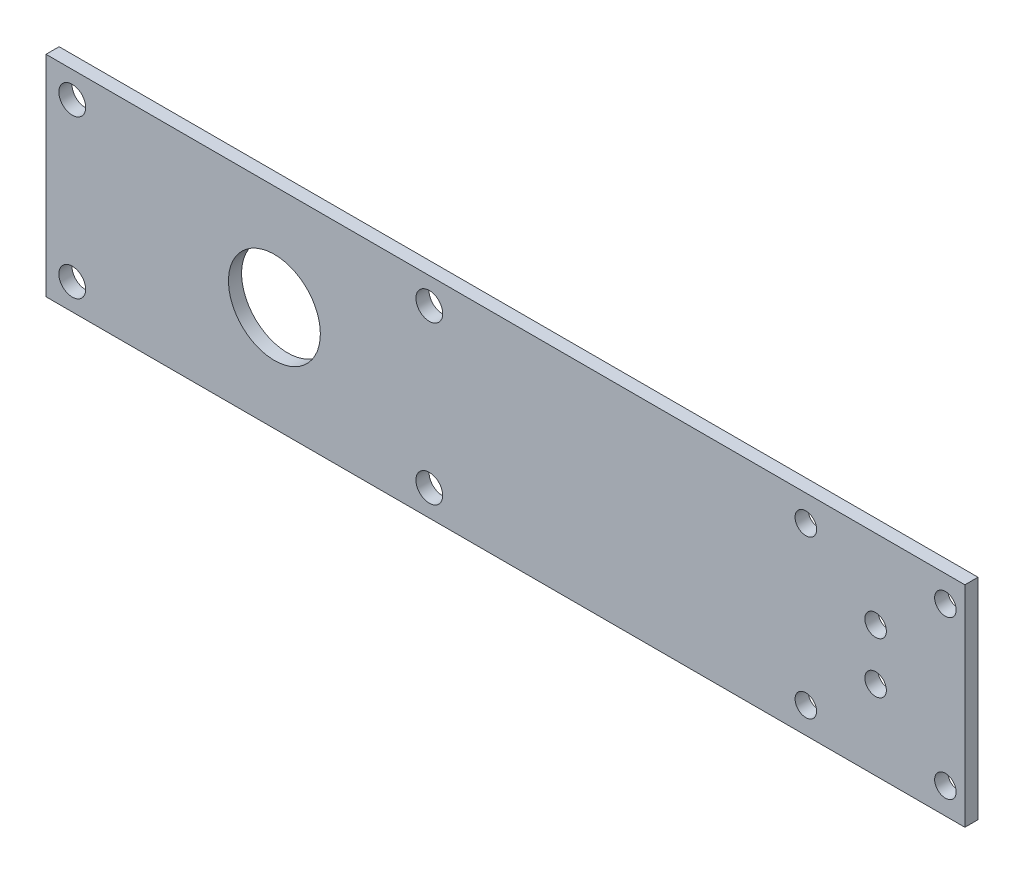
ISO-10303-21;
HEADER;
FILE_DESCRIPTION(('STEP AP214'),'2;1');
FILE_NAME('part.step','',(''),(''),'','','');
FILE_SCHEMA(('AUTOMOTIVE_DESIGN { 1 0 10303 214 1 1 1 1 }'));
ENDSEC;
DATA;
#1=APPLICATION_CONTEXT('core data for automotive mechanical design processes');
#2=APPLICATION_PROTOCOL_DEFINITION('international standard','automotive_design',2000,#1);
#3=PRODUCT_CONTEXT('',#1,'mechanical');
#4=PRODUCT('Part','Part','',(#3));
#5=PRODUCT_RELATED_PRODUCT_CATEGORY('part','',(#4));
#6=PRODUCT_DEFINITION_FORMATION('','',#4);
#7=PRODUCT_DEFINITION_CONTEXT('part definition',#1,'design');
#8=PRODUCT_DEFINITION('design','',#6,#7);
#9=PRODUCT_DEFINITION_SHAPE('','',#8);
#10=(LENGTH_UNIT() NAMED_UNIT(*) SI_UNIT(.MILLI.,.METRE.));
#11=(NAMED_UNIT(*) PLANE_ANGLE_UNIT() SI_UNIT($,.RADIAN.));
#12=(NAMED_UNIT(*) SI_UNIT($,.STERADIAN.) SOLID_ANGLE_UNIT());
#13=UNCERTAINTY_MEASURE_WITH_UNIT(LENGTH_MEASURE(1.E-05),#10,'distance_accuracy_value','');
#14=(GEOMETRIC_REPRESENTATION_CONTEXT(3) GLOBAL_UNCERTAINTY_ASSIGNED_CONTEXT((#13)) GLOBAL_UNIT_ASSIGNED_CONTEXT((#10,
#11,#12)) REPRESENTATION_CONTEXT('',''));
#15=CARTESIAN_POINT('',(0.,0.,0.));
#16=DIRECTION('',(0.,0.,1.));
#17=DIRECTION('',(1.,0.,0.));
#18=AXIS2_PLACEMENT_3D('',#15,#16,#17);
#19=CARTESIAN_POINT('',(-87.,-40.,5.));
#20=DIRECTION('',(1.,0.,0.));
#21=DIRECTION('',(0.,1.,0.));
#22=AXIS2_PLACEMENT_3D('',#19,#20,#21);
#23=PLANE('',#22);
#24=DIRECTION('',(0.,-1.,0.));
#25=VECTOR('',#24,1.);
#26=CARTESIAN_POINT('',(-87.,-40.,0.));
#27=LINE('',#26,#25);
#28=CARTESIAN_POINT('',(-87.,40.,0.));
#29=VERTEX_POINT('',#28);
#30=CARTESIAN_POINT('',(-87.,-40.,0.));
#31=VERTEX_POINT('',#30);
#32=EDGE_CURVE('E113',#29,#31,#27,.T.);
#33=ORIENTED_EDGE('',*,*,#32,.T.);
#34=DIRECTION('',(0.,0.,-1.));
#35=VECTOR('',#34,1.);
#36=CARTESIAN_POINT('',(-87.,-40.,5.));
#37=LINE('',#36,#35);
#38=CARTESIAN_POINT('',(-87.,-40.,5.));
#39=VERTEX_POINT('',#38);
#40=EDGE_CURVE('E12',#39,#31,#37,.T.);
#41=ORIENTED_EDGE('',*,*,#40,.F.);
#42=DIRECTION('',(0.,-1.,0.));
#43=VECTOR('',#42,1.);
#44=CARTESIAN_POINT('',(-87.,-40.,5.));
#45=LINE('',#44,#43);
#46=CARTESIAN_POINT('',(-87.,40.,5.));
#47=VERTEX_POINT('',#46);
#48=EDGE_CURVE('E100',#47,#39,#45,.T.);
#49=ORIENTED_EDGE('',*,*,#48,.F.);
#50=DIRECTION('',(0.,0.,-1.));
#51=VECTOR('',#50,1.);
#52=CARTESIAN_POINT('',(-87.,40.,5.));
#53=LINE('',#52,#51);
#54=EDGE_CURVE('E109',#47,#29,#53,.T.);
#55=ORIENTED_EDGE('',*,*,#54,.T.);
#56=EDGE_LOOP('',(#33,#41,#49,#55));
#57=FACE_BOUND('',#56,.T.);
#58=ADVANCED_FACE('F48',(#57),#23,.F.);
#59=CARTESIAN_POINT('',(263.,-40.,5.));
#60=DIRECTION('',(0.,1.,0.));
#61=DIRECTION('',(-1.,0.,0.));
#62=AXIS2_PLACEMENT_3D('',#59,#60,#61);
#63=PLANE('',#62);
#64=DIRECTION('',(1.,0.,0.));
#65=VECTOR('',#64,1.);
#66=CARTESIAN_POINT('',(263.,-40.,0.));
#67=LINE('',#66,#65);
#68=CARTESIAN_POINT('',(263.,-40.,0.));
#69=VERTEX_POINT('',#68);
#70=EDGE_CURVE('E104',#31,#69,#67,.T.);
#71=ORIENTED_EDGE('',*,*,#70,.T.);
#72=DIRECTION('',(0.,0.,-1.));
#73=VECTOR('',#72,1.);
#74=CARTESIAN_POINT('',(263.,-40.,5.));
#75=LINE('',#74,#73);
#76=CARTESIAN_POINT('',(263.,-40.,5.));
#77=VERTEX_POINT('',#76);
#78=EDGE_CURVE('E57',#77,#69,#75,.T.);
#79=ORIENTED_EDGE('',*,*,#78,.F.);
#80=DIRECTION('',(1.,0.,0.));
#81=VECTOR('',#80,1.);
#82=CARTESIAN_POINT('',(263.,-40.,5.));
#83=LINE('',#82,#81);
#84=EDGE_CURVE('E95',#39,#77,#83,.T.);
#85=ORIENTED_EDGE('',*,*,#84,.F.);
#86=ORIENTED_EDGE('',*,*,#40,.T.);
#87=EDGE_LOOP('',(#71,#79,#85,#86));
#88=FACE_BOUND('',#87,.T.);
#89=ADVANCED_FACE('F103',(#88),#63,.F.);
#90=CARTESIAN_POINT('',(263.,-40.,5.));
#91=DIRECTION('',(-1.,0.,0.));
#92=DIRECTION('',(0.,-1.,0.));
#93=AXIS2_PLACEMENT_3D('',#90,#91,#92);
#94=PLANE('',#93);
#95=DIRECTION('',(0.,1.,0.));
#96=VECTOR('',#95,1.);
#97=CARTESIAN_POINT('',(263.,-40.,0.));
#98=LINE('',#97,#96);
#99=CARTESIAN_POINT('',(263.,40.,0.));
#100=VERTEX_POINT('',#99);
#101=EDGE_CURVE('E82',#69,#100,#98,.T.);
#102=ORIENTED_EDGE('',*,*,#101,.T.);
#103=DIRECTION('',(0.,0.,-1.));
#104=VECTOR('',#103,1.);
#105=CARTESIAN_POINT('',(263.,40.,5.));
#106=LINE('',#105,#104);
#107=CARTESIAN_POINT('',(263.,40.,5.));
#108=VERTEX_POINT('',#107);
#109=EDGE_CURVE('E105',#108,#100,#106,.T.);
#110=ORIENTED_EDGE('',*,*,#109,.F.);
#111=DIRECTION('',(0.,1.,0.));
#112=VECTOR('',#111,1.);
#113=CARTESIAN_POINT('',(263.,-40.,5.));
#114=LINE('',#113,#112);
#115=EDGE_CURVE('E98',#77,#108,#114,.T.);
#116=ORIENTED_EDGE('',*,*,#115,.F.);
#117=ORIENTED_EDGE('',*,*,#78,.T.);
#118=EDGE_LOOP('',(#102,#110,#116,#117));
#119=FACE_BOUND('',#118,.T.);
#120=ADVANCED_FACE('F107',(#119),#94,.F.);
#121=CARTESIAN_POINT('',(263.,40.,5.));
#122=DIRECTION('',(0.,-1.,0.));
#123=DIRECTION('',(1.,0.,0.));
#124=AXIS2_PLACEMENT_3D('',#121,#122,#123);
#125=PLANE('',#124);
#126=DIRECTION('',(-1.,0.,0.));
#127=VECTOR('',#126,1.);
#128=CARTESIAN_POINT('',(263.,40.,0.));
#129=LINE('',#128,#127);
#130=EDGE_CURVE('E88',#100,#29,#129,.T.);
#131=ORIENTED_EDGE('',*,*,#130,.T.);
#132=ORIENTED_EDGE('',*,*,#54,.F.);
#133=DIRECTION('',(-1.,0.,0.));
#134=VECTOR('',#133,1.);
#135=CARTESIAN_POINT('',(263.,40.,5.));
#136=LINE('',#135,#134);
#137=EDGE_CURVE('E65',#108,#47,#136,.T.);
#138=ORIENTED_EDGE('',*,*,#137,.F.);
#139=ORIENTED_EDGE('',*,*,#109,.T.);
#140=EDGE_LOOP('',(#131,#132,#138,#139));
#141=FACE_BOUND('',#140,.T.);
#142=ADVANCED_FACE('F131',(#141),#125,.F.);
#143=CARTESIAN_POINT('',(0.,0.,5.));
#144=DIRECTION('',(0.,0.,1.));
#145=DIRECTION('',(1.,0.,0.));
#146=AXIS2_PLACEMENT_3D('',#143,#144,#145);
#147=PLANE('',#146);
#148=CARTESIAN_POINT('',(255.58,30.,5.));
#149=DIRECTION('',(0.,0.,1.));
#150=DIRECTION('',(-1.,0.,0.));
#151=AXIS2_PLACEMENT_3D('',#148,#149,#150);
#152=CIRCLE('',#151,4.09999999999999);
#153=CARTESIAN_POINT('',(251.48,30.,5.));
#154=VERTEX_POINT('',#153);
#155=EDGE_CURVE('E348',#154,#154,#152,.T.);
#156=ORIENTED_EDGE('',*,*,#155,.F.);
#157=EDGE_LOOP('',(#156));
#158=FACE_BOUND('',#157,.T.);
#159=CARTESIAN_POINT('',(255.58,-30.,5.));
#160=DIRECTION('',(0.,0.,1.));
#161=DIRECTION('',(1.,0.,0.));
#162=AXIS2_PLACEMENT_3D('',#159,#160,#161);
#163=CIRCLE('',#162,4.09999999999999);
#164=CARTESIAN_POINT('',(259.68,-30.,5.));
#165=VERTEX_POINT('',#164);
#166=EDGE_CURVE('E353',#165,#165,#163,.T.);
#167=ORIENTED_EDGE('',*,*,#166,.F.);
#168=EDGE_LOOP('',(#167));
#169=FACE_BOUND('',#168,.T.);
#170=CARTESIAN_POINT('',(202.42,-30.,5.));
#171=DIRECTION('',(0.,0.,1.));
#172=DIRECTION('',(-1.,0.,0.));
#173=AXIS2_PLACEMENT_3D('',#170,#171,#172);
#174=CIRCLE('',#173,4.09999999999999);
#175=CARTESIAN_POINT('',(198.32,-30.,5.));
#176=VERTEX_POINT('',#175);
#177=EDGE_CURVE('E365',#176,#176,#174,.T.);
#178=ORIENTED_EDGE('',*,*,#177,.F.);
#179=EDGE_LOOP('',(#178));
#180=FACE_BOUND('',#179,.T.);
#181=CARTESIAN_POINT('',(202.42,30.,5.));
#182=DIRECTION('',(0.,0.,1.));
#183=DIRECTION('',(1.,0.,0.));
#184=AXIS2_PLACEMENT_3D('',#181,#182,#183);
#185=CIRCLE('',#184,4.09999999999999);
#186=CARTESIAN_POINT('',(206.52,30.,5.));
#187=VERTEX_POINT('',#186);
#188=EDGE_CURVE('E176',#187,#187,#185,.T.);
#189=ORIENTED_EDGE('',*,*,#188,.F.);
#190=EDGE_LOOP('',(#189));
#191=FACE_BOUND('',#190,.T.);
#192=CARTESIAN_POINT('',(229.,9.75,5.));
#193=DIRECTION('',(0.,0.,1.));
#194=DIRECTION('',(1.,0.,0.));
#195=AXIS2_PLACEMENT_3D('',#192,#193,#194);
#196=CIRCLE('',#195,4.09999999999999);
#197=CARTESIAN_POINT('',(233.1,9.75,5.));
#198=VERTEX_POINT('',#197);
#199=EDGE_CURVE('E171',#198,#198,#196,.T.);
#200=ORIENTED_EDGE('',*,*,#199,.F.);
#201=EDGE_LOOP('',(#200));
#202=FACE_BOUND('',#201,.T.);
#203=CARTESIAN_POINT('',(229.,-9.75,5.));
#204=DIRECTION('',(0.,0.,1.));
#205=DIRECTION('',(1.,0.,0.));
#206=AXIS2_PLACEMENT_3D('',#203,#204,#205);
#207=CIRCLE('',#206,4.09999999999999);
#208=CARTESIAN_POINT('',(233.1,-9.75,5.));
#209=VERTEX_POINT('',#208);
#210=EDGE_CURVE('E172',#209,#209,#207,.T.);
#211=ORIENTED_EDGE('',*,*,#210,.F.);
#212=EDGE_LOOP('',(#211));
#213=FACE_BOUND('',#212,.T.);
#214=CARTESIAN_POINT('',(-77.,30.,5.));
#215=DIRECTION('',(0.,0.,1.));
#216=DIRECTION('',(1.,0.,0.));
#217=AXIS2_PLACEMENT_3D('',#214,#215,#216);
#218=CIRCLE('',#217,5.1);
#219=CARTESIAN_POINT('',(-71.9,30.,5.));
#220=VERTEX_POINT('',#219);
#221=EDGE_CURVE('E139',#220,#220,#218,.F.);
#222=ORIENTED_EDGE('',*,*,#221,.T.);
#223=EDGE_LOOP('',(#222));
#224=FACE_BOUND('',#223,.T.);
#225=CARTESIAN_POINT('',(59.,-30.,5.));
#226=DIRECTION('',(0.,0.,1.));
#227=DIRECTION('',(1.,0.,0.));
#228=AXIS2_PLACEMENT_3D('',#225,#226,#227);
#229=CIRCLE('',#228,5.1);
#230=CARTESIAN_POINT('',(64.1,-30.,5.));
#231=VERTEX_POINT('',#230);
#232=EDGE_CURVE('E142',#231,#231,#229,.F.);
#233=ORIENTED_EDGE('',*,*,#232,.T.);
#234=EDGE_LOOP('',(#233));
#235=FACE_BOUND('',#234,.T.);
#236=CARTESIAN_POINT('',(-77.,-30.,5.));
#237=DIRECTION('',(0.,0.,1.));
#238=DIRECTION('',(1.,0.,0.));
#239=AXIS2_PLACEMENT_3D('',#236,#237,#238);
#240=CIRCLE('',#239,5.1);
#241=CARTESIAN_POINT('',(-71.9,-30.,5.));
#242=VERTEX_POINT('',#241);
#243=EDGE_CURVE('E145',#242,#242,#240,.F.);
#244=ORIENTED_EDGE('',*,*,#243,.T.);
#245=EDGE_LOOP('',(#244));
#246=FACE_BOUND('',#245,.T.);
#247=CARTESIAN_POINT('',(59.,30.,5.));
#248=DIRECTION('',(0.,0.,1.));
#249=DIRECTION('',(1.,0.,0.));
#250=AXIS2_PLACEMENT_3D('',#247,#248,#249);
#251=CIRCLE('',#250,5.1);
#252=CARTESIAN_POINT('',(64.1,30.,5.));
#253=VERTEX_POINT('',#252);
#254=EDGE_CURVE('E148',#253,#253,#251,.F.);
#255=ORIENTED_EDGE('',*,*,#254,.T.);
#256=EDGE_LOOP('',(#255));
#257=FACE_BOUND('',#256,.T.);
#258=CARTESIAN_POINT('',(0.,0.,5.));
#259=DIRECTION('',(0.,0.,1.));
#260=DIRECTION('',(1.,0.,0.));
#261=AXIS2_PLACEMENT_3D('',#258,#259,#260);
#262=CIRCLE('',#261,17.5);
#263=CARTESIAN_POINT('',(17.5,0.,5.));
#264=VERTEX_POINT('',#263);
#265=EDGE_CURVE('E117',#264,#264,#262,.F.);
#266=ORIENTED_EDGE('',*,*,#265,.T.);
#267=EDGE_LOOP('',(#266));
#268=FACE_BOUND('',#267,.T.);
#269=ORIENTED_EDGE('',*,*,#48,.T.);
#270=ORIENTED_EDGE('',*,*,#84,.T.);
#271=ORIENTED_EDGE('',*,*,#115,.T.);
#272=ORIENTED_EDGE('',*,*,#137,.T.);
#273=EDGE_LOOP('',(#269,#270,#271,#272));
#274=FACE_BOUND('',#273,.T.);
#275=ADVANCED_FACE('F96',(#158,#169,#180,#191,#202,#213,#224,#235,#246,#257,#268,#274),#147,.T.);
#276=CARTESIAN_POINT('',(0.,0.,0.));
#277=DIRECTION('',(0.,0.,1.));
#278=DIRECTION('',(1.,0.,0.));
#279=AXIS2_PLACEMENT_3D('',#276,#277,#278);
#280=PLANE('',#279);
#281=CARTESIAN_POINT('',(255.58,30.,0.));
#282=DIRECTION('',(0.,0.,1.));
#283=DIRECTION('',(-1.,0.,0.));
#284=AXIS2_PLACEMENT_3D('',#281,#282,#283);
#285=CIRCLE('',#284,4.09999999999999);
#286=CARTESIAN_POINT('',(251.48,30.,0.));
#287=VERTEX_POINT('',#286);
#288=EDGE_CURVE('E351',#287,#287,#285,.T.);
#289=ORIENTED_EDGE('',*,*,#288,.T.);
#290=EDGE_LOOP('',(#289));
#291=FACE_BOUND('',#290,.T.);
#292=CARTESIAN_POINT('',(255.58,-30.,0.));
#293=DIRECTION('',(0.,0.,1.));
#294=DIRECTION('',(1.,0.,0.));
#295=AXIS2_PLACEMENT_3D('',#292,#293,#294);
#296=CIRCLE('',#295,4.09999999999999);
#297=CARTESIAN_POINT('',(259.68,-30.,0.));
#298=VERTEX_POINT('',#297);
#299=EDGE_CURVE('E357',#298,#298,#296,.T.);
#300=ORIENTED_EDGE('',*,*,#299,.T.);
#301=EDGE_LOOP('',(#300));
#302=FACE_BOUND('',#301,.T.);
#303=CARTESIAN_POINT('',(202.42,-30.,0.));
#304=DIRECTION('',(0.,0.,1.));
#305=DIRECTION('',(-1.,0.,0.));
#306=AXIS2_PLACEMENT_3D('',#303,#304,#305);
#307=CIRCLE('',#306,4.09999999999999);
#308=CARTESIAN_POINT('',(198.32,-30.,0.));
#309=VERTEX_POINT('',#308);
#310=EDGE_CURVE('E195',#309,#309,#307,.T.);
#311=ORIENTED_EDGE('',*,*,#310,.T.);
#312=EDGE_LOOP('',(#311));
#313=FACE_BOUND('',#312,.T.);
#314=CARTESIAN_POINT('',(202.42,30.,0.));
#315=DIRECTION('',(0.,0.,1.));
#316=DIRECTION('',(1.,0.,0.));
#317=AXIS2_PLACEMENT_3D('',#314,#315,#316);
#318=CIRCLE('',#317,4.09999999999999);
#319=CARTESIAN_POINT('',(206.52,30.,0.));
#320=VERTEX_POINT('',#319);
#321=EDGE_CURVE('E190',#320,#320,#318,.T.);
#322=ORIENTED_EDGE('',*,*,#321,.T.);
#323=EDGE_LOOP('',(#322));
#324=FACE_BOUND('',#323,.T.);
#325=CARTESIAN_POINT('',(229.,9.75,0.));
#326=DIRECTION('',(0.,0.,1.));
#327=DIRECTION('',(1.,0.,0.));
#328=AXIS2_PLACEMENT_3D('',#325,#326,#327);
#329=CIRCLE('',#328,4.09999999999999);
#330=CARTESIAN_POINT('',(233.1,9.75,0.));
#331=VERTEX_POINT('',#330);
#332=EDGE_CURVE('E181',#331,#331,#329,.T.);
#333=ORIENTED_EDGE('',*,*,#332,.T.);
#334=EDGE_LOOP('',(#333));
#335=FACE_BOUND('',#334,.T.);
#336=CARTESIAN_POINT('',(229.,-9.75,0.));
#337=DIRECTION('',(0.,0.,1.));
#338=DIRECTION('',(1.,0.,0.));
#339=AXIS2_PLACEMENT_3D('',#336,#337,#338);
#340=CIRCLE('',#339,4.09999999999999);
#341=CARTESIAN_POINT('',(233.1,-9.75,0.));
#342=VERTEX_POINT('',#341);
#343=EDGE_CURVE('E175',#342,#342,#340,.T.);
#344=ORIENTED_EDGE('',*,*,#343,.T.);
#345=EDGE_LOOP('',(#344));
#346=FACE_BOUND('',#345,.T.);
#347=CARTESIAN_POINT('',(-77.,30.,-1.74513181683267E-12));
#348=DIRECTION('',(0.,0.,1.));
#349=DIRECTION('',(1.,0.,0.));
#350=AXIS2_PLACEMENT_3D('',#347,#348,#349);
#351=CIRCLE('',#350,5.1);
#352=CARTESIAN_POINT('',(-71.9,30.,-1.74513181683267E-12));
#353=VERTEX_POINT('',#352);
#354=EDGE_CURVE('E155',#353,#353,#351,.T.);
#355=ORIENTED_EDGE('',*,*,#354,.T.);
#356=EDGE_LOOP('',(#355));
#357=FACE_BOUND('',#356,.T.);
#358=CARTESIAN_POINT('',(59.,-30.,-1.74513181683267E-12));
#359=DIRECTION('',(0.,0.,1.));
#360=DIRECTION('',(-1.,0.,0.));
#361=AXIS2_PLACEMENT_3D('',#358,#359,#360);
#362=CIRCLE('',#361,5.1);
#363=CARTESIAN_POINT('',(53.9,-30.,-1.74513181683267E-12));
#364=VERTEX_POINT('',#363);
#365=EDGE_CURVE('E156',#364,#364,#362,.T.);
#366=ORIENTED_EDGE('',*,*,#365,.T.);
#367=EDGE_LOOP('',(#366));
#368=FACE_BOUND('',#367,.T.);
#369=CARTESIAN_POINT('',(-77.,-30.,-1.74513181683267E-12));
#370=DIRECTION('',(0.,0.,1.));
#371=DIRECTION('',(-1.,0.,0.));
#372=AXIS2_PLACEMENT_3D('',#369,#370,#371);
#373=CIRCLE('',#372,5.1);
#374=CARTESIAN_POINT('',(-82.1,-30.,-1.74513181683267E-12));
#375=VERTEX_POINT('',#374);
#376=EDGE_CURVE('E161',#375,#375,#373,.T.);
#377=ORIENTED_EDGE('',*,*,#376,.T.);
#378=EDGE_LOOP('',(#377));
#379=FACE_BOUND('',#378,.T.);
#380=CARTESIAN_POINT('',(59.,30.,-1.74513181683267E-12));
#381=DIRECTION('',(0.,0.,1.));
#382=DIRECTION('',(1.,0.,0.));
#383=AXIS2_PLACEMENT_3D('',#380,#381,#382);
#384=CIRCLE('',#383,5.1);
#385=CARTESIAN_POINT('',(64.1,30.,-1.74513181683267E-12));
#386=VERTEX_POINT('',#385);
#387=EDGE_CURVE('E150',#386,#386,#384,.T.);
#388=ORIENTED_EDGE('',*,*,#387,.T.);
#389=EDGE_LOOP('',(#388));
#390=FACE_BOUND('',#389,.T.);
#391=CARTESIAN_POINT('',(0.,0.,0.));
#392=DIRECTION('',(0.,0.,1.));
#393=DIRECTION('',(1.,0.,0.));
#394=AXIS2_PLACEMENT_3D('',#391,#392,#393);
#395=CIRCLE('',#394,17.5);
#396=CARTESIAN_POINT('',(17.5,0.,0.));
#397=VERTEX_POINT('',#396);
#398=EDGE_CURVE('E51',#397,#397,#395,.F.);
#399=ORIENTED_EDGE('',*,*,#398,.F.);
#400=EDGE_LOOP('',(#399));
#401=FACE_BOUND('',#400,.T.);
#402=ORIENTED_EDGE('',*,*,#32,.F.);
#403=ORIENTED_EDGE('',*,*,#130,.F.);
#404=ORIENTED_EDGE('',*,*,#101,.F.);
#405=ORIENTED_EDGE('',*,*,#70,.F.);
#406=EDGE_LOOP('',(#402,#403,#404,#405));
#407=FACE_BOUND('',#406,.T.);
#408=ADVANCED_FACE('F134',(#291,#302,#313,#324,#335,#346,#357,#368,#379,#390,#401,#407),#280,.F.);
#409=CARTESIAN_POINT('',(0.,0.,46.7572620118292));
#410=DIRECTION('',(0.,0.,-1.));
#411=DIRECTION('',(-1.,0.,0.));
#412=AXIS2_PLACEMENT_3D('',#409,#410,#411);
#413=CYLINDRICAL_SURFACE('',#412,17.5);
#414=ORIENTED_EDGE('',*,*,#265,.F.);
#415=EDGE_LOOP('',(#414));
#416=FACE_BOUND('',#415,.T.);
#417=ORIENTED_EDGE('',*,*,#398,.T.);
#418=EDGE_LOOP('',(#417));
#419=FACE_BOUND('',#418,.T.);
#420=ADVANCED_FACE('F235',(#416,#419),#413,.F.);
#421=CARTESIAN_POINT('',(59.,30.,9.99999999999826));
#422=DIRECTION('',(0.,0.,-1.));
#423=DIRECTION('',(-1.,0.,0.));
#424=AXIS2_PLACEMENT_3D('',#421,#422,#423);
#425=CYLINDRICAL_SURFACE('',#424,5.1);
#426=ORIENTED_EDGE('',*,*,#254,.F.);
#427=EDGE_LOOP('',(#426));
#428=FACE_BOUND('',#427,.T.);
#429=ORIENTED_EDGE('',*,*,#387,.F.);
#430=EDGE_LOOP('',(#429));
#431=FACE_BOUND('',#430,.T.);
#432=ADVANCED_FACE('F241',(#428,#431),#425,.F.);
#433=CARTESIAN_POINT('',(-77.,-30.,9.99999999999826));
#434=DIRECTION('',(0.,0.,-1.));
#435=DIRECTION('',(-1.,0.,0.));
#436=AXIS2_PLACEMENT_3D('',#433,#434,#435);
#437=CYLINDRICAL_SURFACE('',#436,5.1);
#438=ORIENTED_EDGE('',*,*,#243,.F.);
#439=EDGE_LOOP('',(#438));
#440=FACE_BOUND('',#439,.T.);
#441=ORIENTED_EDGE('',*,*,#376,.F.);
#442=EDGE_LOOP('',(#441));
#443=FACE_BOUND('',#442,.T.);
#444=ADVANCED_FACE('F245',(#440,#443),#437,.F.);
#445=CARTESIAN_POINT('',(59.,-30.,9.99999999999826));
#446=DIRECTION('',(0.,0.,-1.));
#447=DIRECTION('',(-1.,0.,0.));
#448=AXIS2_PLACEMENT_3D('',#445,#446,#447);
#449=CYLINDRICAL_SURFACE('',#448,5.1);
#450=ORIENTED_EDGE('',*,*,#232,.F.);
#451=EDGE_LOOP('',(#450));
#452=FACE_BOUND('',#451,.T.);
#453=ORIENTED_EDGE('',*,*,#365,.F.);
#454=EDGE_LOOP('',(#453));
#455=FACE_BOUND('',#454,.T.);
#456=ADVANCED_FACE('F247',(#452,#455),#449,.F.);
#457=CARTESIAN_POINT('',(-77.,30.,9.99999999999826));
#458=DIRECTION('',(0.,0.,-1.));
#459=DIRECTION('',(-1.,0.,0.));
#460=AXIS2_PLACEMENT_3D('',#457,#458,#459);
#461=CYLINDRICAL_SURFACE('',#460,5.1);
#462=ORIENTED_EDGE('',*,*,#221,.F.);
#463=EDGE_LOOP('',(#462));
#464=FACE_BOUND('',#463,.T.);
#465=ORIENTED_EDGE('',*,*,#354,.F.);
#466=EDGE_LOOP('',(#465));
#467=FACE_BOUND('',#466,.T.);
#468=ADVANCED_FACE('F219',(#464,#467),#461,.F.);
#469=CARTESIAN_POINT('',(229.,-9.75,5.));
#470=DIRECTION('',(0.,0.,-1.));
#471=DIRECTION('',(-1.,0.,0.));
#472=AXIS2_PLACEMENT_3D('',#469,#470,#471);
#473=CYLINDRICAL_SURFACE('',#472,4.09999999999999);
#474=ORIENTED_EDGE('',*,*,#210,.T.);
#475=EDGE_LOOP('',(#474));
#476=FACE_BOUND('',#475,.T.);
#477=ORIENTED_EDGE('',*,*,#343,.F.);
#478=EDGE_LOOP('',(#477));
#479=FACE_BOUND('',#478,.T.);
#480=ADVANCED_FACE('F209',(#476,#479),#473,.F.);
#481=CARTESIAN_POINT('',(229.,9.75,5.));
#482=DIRECTION('',(0.,0.,-1.));
#483=DIRECTION('',(-1.,0.,0.));
#484=AXIS2_PLACEMENT_3D('',#481,#482,#483);
#485=CYLINDRICAL_SURFACE('',#484,4.09999999999999);
#486=ORIENTED_EDGE('',*,*,#199,.T.);
#487=EDGE_LOOP('',(#486));
#488=FACE_BOUND('',#487,.T.);
#489=ORIENTED_EDGE('',*,*,#332,.F.);
#490=EDGE_LOOP('',(#489));
#491=FACE_BOUND('',#490,.T.);
#492=ADVANCED_FACE('F206',(#488,#491),#485,.F.);
#493=CARTESIAN_POINT('',(202.42,30.,5.));
#494=DIRECTION('',(0.,0.,-1.));
#495=DIRECTION('',(-1.,0.,0.));
#496=AXIS2_PLACEMENT_3D('',#493,#494,#495);
#497=CYLINDRICAL_SURFACE('',#496,4.09999999999999);
#498=ORIENTED_EDGE('',*,*,#188,.T.);
#499=EDGE_LOOP('',(#498));
#500=FACE_BOUND('',#499,.T.);
#501=ORIENTED_EDGE('',*,*,#321,.F.);
#502=EDGE_LOOP('',(#501));
#503=FACE_BOUND('',#502,.T.);
#504=ADVANCED_FACE('F208',(#500,#503),#497,.F.);
#505=CARTESIAN_POINT('',(202.42,-30.,5.));
#506=DIRECTION('',(0.,0.,-1.));
#507=DIRECTION('',(-1.,0.,0.));
#508=AXIS2_PLACEMENT_3D('',#505,#506,#507);
#509=CYLINDRICAL_SURFACE('',#508,4.09999999999999);
#510=ORIENTED_EDGE('',*,*,#177,.T.);
#511=EDGE_LOOP('',(#510));
#512=FACE_BOUND('',#511,.T.);
#513=ORIENTED_EDGE('',*,*,#310,.F.);
#514=EDGE_LOOP('',(#513));
#515=FACE_BOUND('',#514,.T.);
#516=ADVANCED_FACE('F216',(#512,#515),#509,.F.);
#517=CARTESIAN_POINT('',(255.58,-30.,5.));
#518=DIRECTION('',(0.,0.,-1.));
#519=DIRECTION('',(-1.,0.,0.));
#520=AXIS2_PLACEMENT_3D('',#517,#518,#519);
#521=CYLINDRICAL_SURFACE('',#520,4.09999999999999);
#522=ORIENTED_EDGE('',*,*,#166,.T.);
#523=EDGE_LOOP('',(#522));
#524=FACE_BOUND('',#523,.T.);
#525=ORIENTED_EDGE('',*,*,#299,.F.);
#526=EDGE_LOOP('',(#525));
#527=FACE_BOUND('',#526,.T.);
#528=ADVANCED_FACE('F322',(#524,#527),#521,.F.);
#529=CARTESIAN_POINT('',(255.58,30.,5.));
#530=DIRECTION('',(0.,0.,-1.));
#531=DIRECTION('',(-1.,0.,0.));
#532=AXIS2_PLACEMENT_3D('',#529,#530,#531);
#533=CYLINDRICAL_SURFACE('',#532,4.09999999999999);
#534=ORIENTED_EDGE('',*,*,#155,.T.);
#535=EDGE_LOOP('',(#534));
#536=FACE_BOUND('',#535,.T.);
#537=ORIENTED_EDGE('',*,*,#288,.F.);
#538=EDGE_LOOP('',(#537));
#539=FACE_BOUND('',#538,.T.);
#540=ADVANCED_FACE('F332',(#536,#539),#533,.F.);
#541=CLOSED_SHELL('',(#58,#89,#120,#142,#275,#408,#420,#432,#444,#456,#468,#480,#492,#504,#516,
#528,#540));
#542=MANIFOLD_SOLID_BREP('B2',#541);
#543=ADVANCED_BREP_SHAPE_REPRESENTATION('',(#18,#542),#14);
#544=SHAPE_DEFINITION_REPRESENTATION(#9,#543);
ENDSEC;
END-ISO-10303-21;
